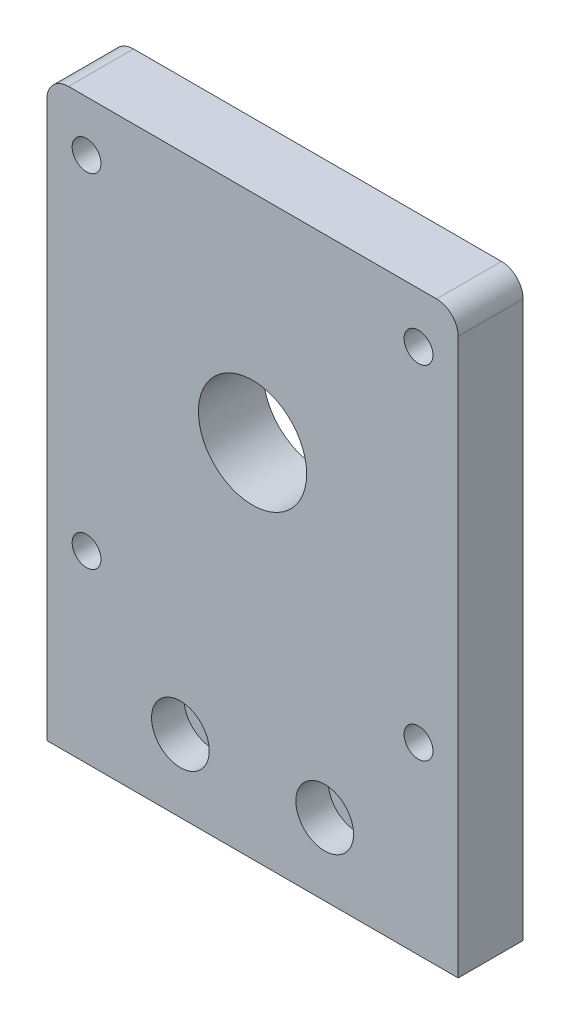
ISO-10303-21;
HEADER;
FILE_DESCRIPTION(('STEP AP214'),'2;1');
FILE_NAME('part.step','',(''),(''),'','','');
FILE_SCHEMA(('AUTOMOTIVE_DESIGN { 1 0 10303 214 1 1 1 1 }'));
ENDSEC;
DATA;
#1=APPLICATION_CONTEXT('core data for automotive mechanical design processes');
#2=APPLICATION_PROTOCOL_DEFINITION('international standard','automotive_design',2000,#1);
#3=PRODUCT_CONTEXT('',#1,'mechanical');
#4=PRODUCT('Part','Part','',(#3));
#5=PRODUCT_RELATED_PRODUCT_CATEGORY('part','',(#4));
#6=PRODUCT_DEFINITION_FORMATION('','',#4);
#7=PRODUCT_DEFINITION_CONTEXT('part definition',#1,'design');
#8=PRODUCT_DEFINITION('design','',#6,#7);
#9=PRODUCT_DEFINITION_SHAPE('','',#8);
#10=(LENGTH_UNIT() NAMED_UNIT(*) SI_UNIT(.MILLI.,.METRE.));
#11=(NAMED_UNIT(*) PLANE_ANGLE_UNIT() SI_UNIT($,.RADIAN.));
#12=(NAMED_UNIT(*) SI_UNIT($,.STERADIAN.) SOLID_ANGLE_UNIT());
#13=UNCERTAINTY_MEASURE_WITH_UNIT(LENGTH_MEASURE(1.E-05),#10,'distance_accuracy_value','');
#14=(GEOMETRIC_REPRESENTATION_CONTEXT(3) GLOBAL_UNCERTAINTY_ASSIGNED_CONTEXT((#13)) GLOBAL_UNIT_ASSIGNED_CONTEXT((#10,
#11,#12)) REPRESENTATION_CONTEXT('',''));
#15=CARTESIAN_POINT('',(0.,0.,0.));
#16=DIRECTION('',(0.,0.,1.));
#17=DIRECTION('',(1.,0.,0.));
#18=AXIS2_PLACEMENT_3D('',#15,#16,#17);
#19=CARTESIAN_POINT('',(10.,-30.,9.));
#20=DIRECTION('',(0.,0.,-1.));
#21=DIRECTION('',(-1.,0.,0.));
#22=AXIS2_PLACEMENT_3D('',#19,#20,#21);
#23=CYLINDRICAL_SURFACE('',#22,2.);
#24=CARTESIAN_POINT('',(10.,-30.,0.));
#25=DIRECTION('',(0.,0.,1.));
#26=DIRECTION('',(1.,0.,0.));
#27=AXIS2_PLACEMENT_3D('',#24,#25,#26);
#28=CIRCLE('',#27,2.);
#29=CARTESIAN_POINT('',(12.,-30.,0.));
#30=VERTEX_POINT('',#29);
#31=EDGE_CURVE('E182',#30,#30,#28,.T.);
#32=ORIENTED_EDGE('',*,*,#31,.F.);
#33=EDGE_LOOP('',(#32));
#34=FACE_BOUND('',#33,.T.);
#35=CARTESIAN_POINT('',(10.,-30.,4.5));
#36=DIRECTION('',(0.,0.,1.));
#37=DIRECTION('',(1.,0.,0.));
#38=AXIS2_PLACEMENT_3D('',#35,#36,#37);
#39=CIRCLE('',#38,2.);
#40=CARTESIAN_POINT('',(12.,-30.,4.5));
#41=VERTEX_POINT('',#40);
#42=EDGE_CURVE('E39',#41,#41,#39,.T.);
#43=ORIENTED_EDGE('',*,*,#42,.T.);
#44=EDGE_LOOP('',(#43));
#45=FACE_BOUND('',#44,.T.);
#46=ADVANCED_FACE('F35',(#34,#45),#23,.F.);
#47=CARTESIAN_POINT('',(-9.99999999999999,-30.,9.));
#48=DIRECTION('',(0.,0.,-1.));
#49=DIRECTION('',(-1.,0.,0.));
#50=AXIS2_PLACEMENT_3D('',#47,#48,#49);
#51=CYLINDRICAL_SURFACE('',#50,2.);
#52=CARTESIAN_POINT('',(-9.99999999999999,-30.,0.));
#53=DIRECTION('',(0.,0.,1.));
#54=DIRECTION('',(1.,0.,0.));
#55=AXIS2_PLACEMENT_3D('',#52,#53,#54);
#56=CIRCLE('',#55,2.);
#57=CARTESIAN_POINT('',(-7.99999999999999,-30.,0.));
#58=VERTEX_POINT('',#57);
#59=EDGE_CURVE('E177',#58,#58,#56,.T.);
#60=ORIENTED_EDGE('',*,*,#59,.F.);
#61=EDGE_LOOP('',(#60));
#62=FACE_BOUND('',#61,.T.);
#63=CARTESIAN_POINT('',(-9.99999999999999,-30.,4.5));
#64=DIRECTION('',(0.,0.,1.));
#65=DIRECTION('',(1.,0.,0.));
#66=AXIS2_PLACEMENT_3D('',#63,#64,#65);
#67=CIRCLE('',#66,2.);
#68=CARTESIAN_POINT('',(-7.99999999999999,-30.,4.5));
#69=VERTEX_POINT('',#68);
#70=EDGE_CURVE('E139',#69,#69,#67,.T.);
#71=ORIENTED_EDGE('',*,*,#70,.T.);
#72=EDGE_LOOP('',(#71));
#73=FACE_BOUND('',#72,.T.);
#74=ADVANCED_FACE('F216',(#62,#73),#51,.F.);
#75=CARTESIAN_POINT('',(-25.5,37.,9.));
#76=DIRECTION('',(0.,0.,1.));
#77=DIRECTION('',(1.,0.,0.));
#78=AXIS2_PLACEMENT_3D('',#75,#76,#77);
#79=PLANE('',#78);
#80=CARTESIAN_POINT('',(10.,-30.,9.));
#81=DIRECTION('',(0.,0.,1.));
#82=DIRECTION('',(1.,0.,0.));
#83=AXIS2_PLACEMENT_3D('',#80,#81,#82);
#84=CIRCLE('',#83,4.);
#85=CARTESIAN_POINT('',(14.,-30.,9.));
#86=VERTEX_POINT('',#85);
#87=EDGE_CURVE('E156',#86,#86,#84,.T.);
#88=ORIENTED_EDGE('',*,*,#87,.F.);
#89=EDGE_LOOP('',(#88));
#90=FACE_BOUND('',#89,.T.);
#91=CARTESIAN_POINT('',(-9.99999999999999,-30.,9.));
#92=DIRECTION('',(0.,0.,1.));
#93=DIRECTION('',(1.,0.,0.));
#94=AXIS2_PLACEMENT_3D('',#91,#92,#93);
#95=CIRCLE('',#94,4.);
#96=CARTESIAN_POINT('',(-5.99999999999999,-30.,9.));
#97=VERTEX_POINT('',#96);
#98=EDGE_CURVE('E149',#97,#97,#95,.T.);
#99=ORIENTED_EDGE('',*,*,#98,.F.);
#100=EDGE_LOOP('',(#99));
#101=FACE_BOUND('',#100,.T.);
#102=CARTESIAN_POINT('',(23.,-14.5,9.));
#103=DIRECTION('',(0.,0.,1.));
#104=DIRECTION('',(-1.,0.,0.));
#105=AXIS2_PLACEMENT_3D('',#102,#103,#104);
#106=CIRCLE('',#105,2.);
#107=CARTESIAN_POINT('',(21.,-14.5,9.));
#108=VERTEX_POINT('',#107);
#109=EDGE_CURVE('E162',#108,#108,#106,.T.);
#110=ORIENTED_EDGE('',*,*,#109,.F.);
#111=EDGE_LOOP('',(#110));
#112=FACE_BOUND('',#111,.T.);
#113=CARTESIAN_POINT('',(-23.,33.,9.));
#114=DIRECTION('',(0.,0.,1.));
#115=DIRECTION('',(1.,0.,0.));
#116=AXIS2_PLACEMENT_3D('',#113,#114,#115);
#117=CIRCLE('',#116,2.);
#118=CARTESIAN_POINT('',(-21.,33.,9.));
#119=VERTEX_POINT('',#118);
#120=EDGE_CURVE('E174',#119,#119,#117,.T.);
#121=ORIENTED_EDGE('',*,*,#120,.F.);
#122=EDGE_LOOP('',(#121));
#123=FACE_BOUND('',#122,.T.);
#124=DIRECTION('',(0.,1.,0.));
#125=VECTOR('',#124,1.);
#126=CARTESIAN_POINT('',(28.5,37.,9.));
#127=LINE('',#126,#125);
#128=CARTESIAN_POINT('',(28.5,-40.,9.));
#129=VERTEX_POINT('',#128);
#130=CARTESIAN_POINT('',(28.5,37.,9.));
#131=VERTEX_POINT('',#130);
#132=EDGE_CURVE('E134',#129,#131,#127,.T.);
#133=ORIENTED_EDGE('',*,*,#132,.T.);
#134=CARTESIAN_POINT('',(25.5,37.,9.));
#135=DIRECTION('',(0.,0.,1.));
#136=DIRECTION('',(-1.,0.,0.));
#137=AXIS2_PLACEMENT_3D('',#134,#135,#136);
#138=CIRCLE('',#137,3.);
#139=CARTESIAN_POINT('',(25.5,40.,9.));
#140=VERTEX_POINT('',#139);
#141=EDGE_CURVE('E91',#131,#140,#138,.T.);
#142=ORIENTED_EDGE('',*,*,#141,.T.);
#143=DIRECTION('',(-1.,0.,0.));
#144=VECTOR('',#143,1.);
#145=CARTESIAN_POINT('',(-25.5,40.,9.));
#146=LINE('',#145,#144);
#147=CARTESIAN_POINT('',(-25.5,40.,9.));
#148=VERTEX_POINT('',#147);
#149=EDGE_CURVE('E105',#140,#148,#146,.T.);
#150=ORIENTED_EDGE('',*,*,#149,.T.);
#151=CARTESIAN_POINT('',(-25.5,37.,9.));
#152=DIRECTION('',(0.,0.,1.));
#153=DIRECTION('',(1.,0.,0.));
#154=AXIS2_PLACEMENT_3D('',#151,#152,#153);
#155=CIRCLE('',#154,3.);
#156=CARTESIAN_POINT('',(-28.5,37.,9.));
#157=VERTEX_POINT('',#156);
#158=EDGE_CURVE('E98',#148,#157,#155,.T.);
#159=ORIENTED_EDGE('',*,*,#158,.T.);
#160=DIRECTION('',(0.,-1.,0.));
#161=VECTOR('',#160,1.);
#162=CARTESIAN_POINT('',(-28.5,37.,9.));
#163=LINE('',#162,#161);
#164=CARTESIAN_POINT('',(-28.5,-40.,9.));
#165=VERTEX_POINT('',#164);
#166=EDGE_CURVE('E103',#157,#165,#163,.T.);
#167=ORIENTED_EDGE('',*,*,#166,.T.);
#168=DIRECTION('',(1.,0.,0.));
#169=VECTOR('',#168,1.);
#170=CARTESIAN_POINT('',(-28.5,-40.,9.));
#171=LINE('',#170,#169);
#172=EDGE_CURVE('E54',#165,#129,#171,.T.);
#173=ORIENTED_EDGE('',*,*,#172,.T.);
#174=EDGE_LOOP('',(#133,#142,#150,#159,#167,#173));
#175=FACE_BOUND('',#174,.T.);
#176=CARTESIAN_POINT('',(0.,10.,9.));
#177=DIRECTION('',(0.,0.,1.));
#178=DIRECTION('',(1.,0.,0.));
#179=AXIS2_PLACEMENT_3D('',#176,#177,#178);
#180=CIRCLE('',#179,7.5);
#181=CARTESIAN_POINT('',(7.5,10.,9.));
#182=VERTEX_POINT('',#181);
#183=EDGE_CURVE('E127',#182,#182,#180,.T.);
#184=ORIENTED_EDGE('',*,*,#183,.F.);
#185=EDGE_LOOP('',(#184));
#186=FACE_BOUND('',#185,.T.);
#187=CARTESIAN_POINT('',(-23.,-14.5,9.));
#188=DIRECTION('',(0.,0.,1.));
#189=DIRECTION('',(1.,0.,0.));
#190=AXIS2_PLACEMENT_3D('',#187,#188,#189);
#191=CIRCLE('',#190,2.);
#192=CARTESIAN_POINT('',(-21.,-14.5,9.));
#193=VERTEX_POINT('',#192);
#194=EDGE_CURVE('E168',#193,#193,#191,.T.);
#195=ORIENTED_EDGE('',*,*,#194,.F.);
#196=EDGE_LOOP('',(#195));
#197=FACE_BOUND('',#196,.T.);
#198=CARTESIAN_POINT('',(23.,33.,9.));
#199=DIRECTION('',(0.,0.,1.));
#200=DIRECTION('',(-1.,0.,0.));
#201=AXIS2_PLACEMENT_3D('',#198,#199,#200);
#202=CIRCLE('',#201,2.);
#203=CARTESIAN_POINT('',(21.,33.,9.));
#204=VERTEX_POINT('',#203);
#205=EDGE_CURVE('E146',#204,#204,#202,.T.);
#206=ORIENTED_EDGE('',*,*,#205,.F.);
#207=EDGE_LOOP('',(#206));
#208=FACE_BOUND('',#207,.T.);
#209=ADVANCED_FACE('F100',(#90,#101,#112,#123,#175,#186,#197,#208),#79,.T.);
#210=CARTESIAN_POINT('',(-25.5,37.,0.));
#211=DIRECTION('',(0.,0.,1.));
#212=DIRECTION('',(1.,0.,0.));
#213=AXIS2_PLACEMENT_3D('',#210,#211,#212);
#214=PLANE('',#213);
#215=DIRECTION('',(0.,1.,0.));
#216=VECTOR('',#215,1.);
#217=CARTESIAN_POINT('',(28.5,37.,0.));
#218=LINE('',#217,#216);
#219=CARTESIAN_POINT('',(28.5,-40.,0.));
#220=VERTEX_POINT('',#219);
#221=CARTESIAN_POINT('',(28.5,37.,0.));
#222=VERTEX_POINT('',#221);
#223=EDGE_CURVE('E123',#220,#222,#218,.T.);
#224=ORIENTED_EDGE('',*,*,#223,.F.);
#225=DIRECTION('',(1.,0.,0.));
#226=VECTOR('',#225,1.);
#227=CARTESIAN_POINT('',(-28.5,-40.,0.));
#228=LINE('',#227,#226);
#229=CARTESIAN_POINT('',(-28.5,-40.,0.));
#230=VERTEX_POINT('',#229);
#231=EDGE_CURVE('E83',#230,#220,#228,.T.);
#232=ORIENTED_EDGE('',*,*,#231,.F.);
#233=DIRECTION('',(0.,-1.,0.));
#234=VECTOR('',#233,1.);
#235=CARTESIAN_POINT('',(-28.5,37.,0.));
#236=LINE('',#235,#234);
#237=CARTESIAN_POINT('',(-28.5,37.,0.));
#238=VERTEX_POINT('',#237);
#239=EDGE_CURVE('E77',#238,#230,#236,.T.);
#240=ORIENTED_EDGE('',*,*,#239,.F.);
#241=CARTESIAN_POINT('',(-25.5,37.,0.));
#242=DIRECTION('',(0.,0.,1.));
#243=DIRECTION('',(1.,0.,0.));
#244=AXIS2_PLACEMENT_3D('',#241,#242,#243);
#245=CIRCLE('',#244,3.);
#246=CARTESIAN_POINT('',(-25.5,40.,0.));
#247=VERTEX_POINT('',#246);
#248=EDGE_CURVE('E113',#247,#238,#245,.T.);
#249=ORIENTED_EDGE('',*,*,#248,.F.);
#250=DIRECTION('',(-1.,0.,0.));
#251=VECTOR('',#250,1.);
#252=CARTESIAN_POINT('',(-25.5,40.,0.));
#253=LINE('',#252,#251);
#254=CARTESIAN_POINT('',(25.5,40.,0.));
#255=VERTEX_POINT('',#254);
#256=EDGE_CURVE('E129',#255,#247,#253,.T.);
#257=ORIENTED_EDGE('',*,*,#256,.F.);
#258=CARTESIAN_POINT('',(25.5,37.,0.));
#259=DIRECTION('',(0.,0.,1.));
#260=DIRECTION('',(-1.,0.,0.));
#261=AXIS2_PLACEMENT_3D('',#258,#259,#260);
#262=CIRCLE('',#261,3.);
#263=EDGE_CURVE('E126',#222,#255,#262,.T.);
#264=ORIENTED_EDGE('',*,*,#263,.F.);
#265=EDGE_LOOP('',(#224,#232,#240,#249,#257,#264));
#266=FACE_BOUND('',#265,.T.);
#267=CARTESIAN_POINT('',(0.,10.,0.));
#268=DIRECTION('',(0.,0.,1.));
#269=DIRECTION('',(1.,0.,0.));
#270=AXIS2_PLACEMENT_3D('',#267,#268,#269);
#271=CIRCLE('',#270,7.5);
#272=CARTESIAN_POINT('',(7.5,10.,0.));
#273=VERTEX_POINT('',#272);
#274=EDGE_CURVE('E185',#273,#273,#271,.T.);
#275=ORIENTED_EDGE('',*,*,#274,.T.);
#276=EDGE_LOOP('',(#275));
#277=FACE_BOUND('',#276,.T.);
#278=ORIENTED_EDGE('',*,*,#31,.T.);
#279=EDGE_LOOP('',(#278));
#280=FACE_BOUND('',#279,.T.);
#281=ORIENTED_EDGE('',*,*,#59,.T.);
#282=EDGE_LOOP('',(#281));
#283=FACE_BOUND('',#282,.T.);
#284=CARTESIAN_POINT('',(-23.,33.,0.));
#285=DIRECTION('',(0.,0.,1.));
#286=DIRECTION('',(1.,0.,0.));
#287=AXIS2_PLACEMENT_3D('',#284,#285,#286);
#288=CIRCLE('',#287,2.);
#289=CARTESIAN_POINT('',(-21.,33.,0.));
#290=VERTEX_POINT('',#289);
#291=EDGE_CURVE('E171',#290,#290,#288,.T.);
#292=ORIENTED_EDGE('',*,*,#291,.T.);
#293=EDGE_LOOP('',(#292));
#294=FACE_BOUND('',#293,.T.);
#295=CARTESIAN_POINT('',(-23.,-14.5,0.));
#296=DIRECTION('',(0.,0.,1.));
#297=DIRECTION('',(1.,0.,0.));
#298=AXIS2_PLACEMENT_3D('',#295,#296,#297);
#299=CIRCLE('',#298,2.);
#300=CARTESIAN_POINT('',(-21.,-14.5,0.));
#301=VERTEX_POINT('',#300);
#302=EDGE_CURVE('E165',#301,#301,#299,.T.);
#303=ORIENTED_EDGE('',*,*,#302,.T.);
#304=EDGE_LOOP('',(#303));
#305=FACE_BOUND('',#304,.T.);
#306=CARTESIAN_POINT('',(23.,-14.5,0.));
#307=DIRECTION('',(0.,0.,1.));
#308=DIRECTION('',(-1.,0.,0.));
#309=AXIS2_PLACEMENT_3D('',#306,#307,#308);
#310=CIRCLE('',#309,2.);
#311=CARTESIAN_POINT('',(21.,-14.5,0.));
#312=VERTEX_POINT('',#311);
#313=EDGE_CURVE('E160',#312,#312,#310,.T.);
#314=ORIENTED_EDGE('',*,*,#313,.T.);
#315=EDGE_LOOP('',(#314));
#316=FACE_BOUND('',#315,.T.);
#317=CARTESIAN_POINT('',(23.,33.,0.));
#318=DIRECTION('',(0.,0.,1.));
#319=DIRECTION('',(-1.,0.,0.));
#320=AXIS2_PLACEMENT_3D('',#317,#318,#319);
#321=CIRCLE('',#320,2.);
#322=CARTESIAN_POINT('',(21.,33.,0.));
#323=VERTEX_POINT('',#322);
#324=EDGE_CURVE('E141',#323,#323,#321,.T.);
#325=ORIENTED_EDGE('',*,*,#324,.T.);
#326=EDGE_LOOP('',(#325));
#327=FACE_BOUND('',#326,.T.);
#328=ADVANCED_FACE('F199',(#266,#277,#280,#283,#294,#305,#316,#327),#214,.F.);
#329=CARTESIAN_POINT('',(28.5,37.,9.));
#330=DIRECTION('',(-1.,0.,0.));
#331=DIRECTION('',(0.,-1.,0.));
#332=AXIS2_PLACEMENT_3D('',#329,#330,#331);
#333=PLANE('',#332);
#334=ORIENTED_EDGE('',*,*,#223,.T.);
#335=DIRECTION('',(0.,0.,-1.));
#336=VECTOR('',#335,1.);
#337=CARTESIAN_POINT('',(28.5,37.,9.));
#338=LINE('',#337,#336);
#339=EDGE_CURVE('E11',#131,#222,#338,.T.);
#340=ORIENTED_EDGE('',*,*,#339,.F.);
#341=ORIENTED_EDGE('',*,*,#132,.F.);
#342=DIRECTION('',(0.,0.,-1.));
#343=VECTOR('',#342,1.);
#344=CARTESIAN_POINT('',(28.5,-40.,9.));
#345=LINE('',#344,#343);
#346=EDGE_CURVE('E119',#129,#220,#345,.T.);
#347=ORIENTED_EDGE('',*,*,#346,.T.);
#348=EDGE_LOOP('',(#334,#340,#341,#347));
#349=FACE_BOUND('',#348,.T.);
#350=ADVANCED_FACE('F37',(#349),#333,.F.);
#351=CARTESIAN_POINT('',(25.5,37.,9.));
#352=DIRECTION('',(0.,0.,-1.));
#353=DIRECTION('',(-1.,0.,0.));
#354=AXIS2_PLACEMENT_3D('',#351,#352,#353);
#355=CYLINDRICAL_SURFACE('',#354,3.);
#356=ORIENTED_EDGE('',*,*,#263,.T.);
#357=DIRECTION('',(0.,0.,-1.));
#358=VECTOR('',#357,1.);
#359=CARTESIAN_POINT('',(25.5,40.,9.));
#360=LINE('',#359,#358);
#361=EDGE_CURVE('E45',#140,#255,#360,.T.);
#362=ORIENTED_EDGE('',*,*,#361,.F.);
#363=ORIENTED_EDGE('',*,*,#141,.F.);
#364=ORIENTED_EDGE('',*,*,#339,.T.);
#365=EDGE_LOOP('',(#356,#362,#363,#364));
#366=FACE_BOUND('',#365,.T.);
#367=ADVANCED_FACE('F193',(#366),#355,.T.);
#368=CARTESIAN_POINT('',(-25.5,40.,9.));
#369=DIRECTION('',(0.,-1.,0.));
#370=DIRECTION('',(1.,0.,0.));
#371=AXIS2_PLACEMENT_3D('',#368,#369,#370);
#372=PLANE('',#371);
#373=ORIENTED_EDGE('',*,*,#256,.T.);
#374=DIRECTION('',(0.,0.,-1.));
#375=VECTOR('',#374,1.);
#376=CARTESIAN_POINT('',(-25.5,40.,9.));
#377=LINE('',#376,#375);
#378=EDGE_CURVE('E114',#148,#247,#377,.T.);
#379=ORIENTED_EDGE('',*,*,#378,.F.);
#380=ORIENTED_EDGE('',*,*,#149,.F.);
#381=ORIENTED_EDGE('',*,*,#361,.T.);
#382=EDGE_LOOP('',(#373,#379,#380,#381));
#383=FACE_BOUND('',#382,.T.);
#384=ADVANCED_FACE('F196',(#383),#372,.F.);
#385=CARTESIAN_POINT('',(-25.5,37.,9.));
#386=DIRECTION('',(0.,0.,-1.));
#387=DIRECTION('',(-1.,0.,0.));
#388=AXIS2_PLACEMENT_3D('',#385,#386,#387);
#389=CYLINDRICAL_SURFACE('',#388,3.);
#390=ORIENTED_EDGE('',*,*,#248,.T.);
#391=DIRECTION('',(0.,0.,-1.));
#392=VECTOR('',#391,1.);
#393=CARTESIAN_POINT('',(-28.5,37.,9.));
#394=LINE('',#393,#392);
#395=EDGE_CURVE('E110',#157,#238,#394,.T.);
#396=ORIENTED_EDGE('',*,*,#395,.F.);
#397=ORIENTED_EDGE('',*,*,#158,.F.);
#398=ORIENTED_EDGE('',*,*,#378,.T.);
#399=EDGE_LOOP('',(#390,#396,#397,#398));
#400=FACE_BOUND('',#399,.T.);
#401=ADVANCED_FACE('F111',(#400),#389,.T.);
#402=CARTESIAN_POINT('',(-28.5,37.,9.));
#403=DIRECTION('',(1.,0.,0.));
#404=DIRECTION('',(0.,1.,0.));
#405=AXIS2_PLACEMENT_3D('',#402,#403,#404);
#406=PLANE('',#405);
#407=ORIENTED_EDGE('',*,*,#239,.T.);
#408=DIRECTION('',(0.,0.,-1.));
#409=VECTOR('',#408,1.);
#410=CARTESIAN_POINT('',(-28.5,-40.,9.));
#411=LINE('',#410,#409);
#412=EDGE_CURVE('E115',#165,#230,#411,.T.);
#413=ORIENTED_EDGE('',*,*,#412,.F.);
#414=ORIENTED_EDGE('',*,*,#166,.F.);
#415=ORIENTED_EDGE('',*,*,#395,.T.);
#416=EDGE_LOOP('',(#407,#413,#414,#415));
#417=FACE_BOUND('',#416,.T.);
#418=ADVANCED_FACE('F117',(#417),#406,.F.);
#419=CARTESIAN_POINT('',(-28.5,-40.,9.));
#420=DIRECTION('',(0.,1.,0.));
#421=DIRECTION('',(0.,0.,1.));
#422=AXIS2_PLACEMENT_3D('',#419,#420,#421);
#423=PLANE('',#422);
#424=ORIENTED_EDGE('',*,*,#231,.T.);
#425=ORIENTED_EDGE('',*,*,#346,.F.);
#426=ORIENTED_EDGE('',*,*,#172,.F.);
#427=ORIENTED_EDGE('',*,*,#412,.T.);
#428=EDGE_LOOP('',(#424,#425,#426,#427));
#429=FACE_BOUND('',#428,.T.);
#430=ADVANCED_FACE('F202',(#429),#423,.F.);
#431=CARTESIAN_POINT('',(0.,10.,9.));
#432=DIRECTION('',(0.,0.,-1.));
#433=DIRECTION('',(-1.,0.,0.));
#434=AXIS2_PLACEMENT_3D('',#431,#432,#433);
#435=CYLINDRICAL_SURFACE('',#434,7.5);
#436=ORIENTED_EDGE('',*,*,#183,.T.);
#437=EDGE_LOOP('',(#436));
#438=FACE_BOUND('',#437,.T.);
#439=ORIENTED_EDGE('',*,*,#274,.F.);
#440=EDGE_LOOP('',(#439));
#441=FACE_BOUND('',#440,.T.);
#442=ADVANCED_FACE('F204',(#438,#441),#435,.F.);
#443=CARTESIAN_POINT('',(-23.,33.,9.));
#444=DIRECTION('',(0.,0.,-1.));
#445=DIRECTION('',(-1.,0.,0.));
#446=AXIS2_PLACEMENT_3D('',#443,#444,#445);
#447=CYLINDRICAL_SURFACE('',#446,2.);
#448=ORIENTED_EDGE('',*,*,#120,.T.);
#449=EDGE_LOOP('',(#448));
#450=FACE_BOUND('',#449,.T.);
#451=ORIENTED_EDGE('',*,*,#291,.F.);
#452=EDGE_LOOP('',(#451));
#453=FACE_BOUND('',#452,.T.);
#454=ADVANCED_FACE('F210',(#450,#453),#447,.F.);
#455=CARTESIAN_POINT('',(-23.,-14.5,9.));
#456=DIRECTION('',(0.,0.,-1.));
#457=DIRECTION('',(-1.,0.,0.));
#458=AXIS2_PLACEMENT_3D('',#455,#456,#457);
#459=CYLINDRICAL_SURFACE('',#458,2.);
#460=ORIENTED_EDGE('',*,*,#194,.T.);
#461=EDGE_LOOP('',(#460));
#462=FACE_BOUND('',#461,.T.);
#463=ORIENTED_EDGE('',*,*,#302,.F.);
#464=EDGE_LOOP('',(#463));
#465=FACE_BOUND('',#464,.T.);
#466=ADVANCED_FACE('F270',(#462,#465),#459,.F.);
#467=CARTESIAN_POINT('',(23.,-14.5,9.));
#468=DIRECTION('',(0.,0.,-1.));
#469=DIRECTION('',(-1.,0.,0.));
#470=AXIS2_PLACEMENT_3D('',#467,#468,#469);
#471=CYLINDRICAL_SURFACE('',#470,2.);
#472=ORIENTED_EDGE('',*,*,#109,.T.);
#473=EDGE_LOOP('',(#472));
#474=FACE_BOUND('',#473,.T.);
#475=ORIENTED_EDGE('',*,*,#313,.F.);
#476=EDGE_LOOP('',(#475));
#477=FACE_BOUND('',#476,.T.);
#478=ADVANCED_FACE('F279',(#474,#477),#471,.F.);
#479=CARTESIAN_POINT('',(23.,33.,9.));
#480=DIRECTION('',(0.,0.,-1.));
#481=DIRECTION('',(-1.,0.,0.));
#482=AXIS2_PLACEMENT_3D('',#479,#480,#481);
#483=CYLINDRICAL_SURFACE('',#482,2.);
#484=ORIENTED_EDGE('',*,*,#205,.T.);
#485=EDGE_LOOP('',(#484));
#486=FACE_BOUND('',#485,.T.);
#487=ORIENTED_EDGE('',*,*,#324,.F.);
#488=EDGE_LOOP('',(#487));
#489=FACE_BOUND('',#488,.T.);
#490=ADVANCED_FACE('F289',(#486,#489),#483,.F.);
#491=CARTESIAN_POINT('',(-9.99999999999999,-30.,4.5));
#492=DIRECTION('',(0.,0.,1.));
#493=DIRECTION('',(1.,0.,0.));
#494=AXIS2_PLACEMENT_3D('',#491,#492,#493);
#495=CYLINDRICAL_SURFACE('',#494,4.);
#496=CARTESIAN_POINT('',(-9.99999999999999,-30.,4.5));
#497=DIRECTION('',(0.,0.,1.));
#498=DIRECTION('',(1.,0.,0.));
#499=AXIS2_PLACEMENT_3D('',#496,#497,#498);
#500=CIRCLE('',#499,4.);
#501=CARTESIAN_POINT('',(-5.99999999999999,-30.,4.5));
#502=VERTEX_POINT('',#501);
#503=EDGE_CURVE('E142',#502,#502,#500,.T.);
#504=ORIENTED_EDGE('',*,*,#503,.F.);
#505=EDGE_LOOP('',(#504));
#506=FACE_BOUND('',#505,.T.);
#507=ORIENTED_EDGE('',*,*,#98,.T.);
#508=EDGE_LOOP('',(#507));
#509=FACE_BOUND('',#508,.T.);
#510=ADVANCED_FACE('F298',(#506,#509),#495,.F.);
#511=CARTESIAN_POINT('',(-9.99999999999999,-30.,4.5));
#512=DIRECTION('',(0.,0.,1.));
#513=DIRECTION('',(1.,0.,0.));
#514=AXIS2_PLACEMENT_3D('',#511,#512,#513);
#515=PLANE('',#514);
#516=ORIENTED_EDGE('',*,*,#70,.F.);
#517=EDGE_LOOP('',(#516));
#518=FACE_BOUND('',#517,.T.);
#519=ORIENTED_EDGE('',*,*,#503,.T.);
#520=EDGE_LOOP('',(#519));
#521=FACE_BOUND('',#520,.T.);
#522=ADVANCED_FACE('F326',(#518,#521),#515,.T.);
#523=CARTESIAN_POINT('',(10.,-30.,4.5));
#524=DIRECTION('',(0.,0.,1.));
#525=DIRECTION('',(1.,0.,0.));
#526=AXIS2_PLACEMENT_3D('',#523,#524,#525);
#527=CYLINDRICAL_SURFACE('',#526,4.);
#528=CARTESIAN_POINT('',(10.,-30.,4.5));
#529=DIRECTION('',(0.,0.,1.));
#530=DIRECTION('',(1.,0.,0.));
#531=AXIS2_PLACEMENT_3D('',#528,#529,#530);
#532=CIRCLE('',#531,4.);
#533=CARTESIAN_POINT('',(14.,-30.,4.5));
#534=VERTEX_POINT('',#533);
#535=EDGE_CURVE('E365',#534,#534,#532,.T.);
#536=ORIENTED_EDGE('',*,*,#535,.F.);
#537=EDGE_LOOP('',(#536));
#538=FACE_BOUND('',#537,.T.);
#539=ORIENTED_EDGE('',*,*,#87,.T.);
#540=EDGE_LOOP('',(#539));
#541=FACE_BOUND('',#540,.T.);
#542=ADVANCED_FACE('F336',(#538,#541),#527,.F.);
#543=CARTESIAN_POINT('',(10.,-30.,4.5));
#544=DIRECTION('',(0.,0.,1.));
#545=DIRECTION('',(1.,0.,0.));
#546=AXIS2_PLACEMENT_3D('',#543,#544,#545);
#547=PLANE('',#546);
#548=ORIENTED_EDGE('',*,*,#42,.F.);
#549=EDGE_LOOP('',(#548));
#550=FACE_BOUND('',#549,.T.);
#551=ORIENTED_EDGE('',*,*,#535,.T.);
#552=EDGE_LOOP('',(#551));
#553=FACE_BOUND('',#552,.T.);
#554=ADVANCED_FACE('F346',(#550,#553),#547,.T.);
#555=CLOSED_SHELL('',(#46,#74,#209,#328,#350,#367,#384,#401,#418,#430,#442,#454,#466,#478,#490,
#510,#522,#542,#554));
#556=MANIFOLD_SOLID_BREP('B2',#555);
#557=ADVANCED_BREP_SHAPE_REPRESENTATION('',(#18,#556),#14);
#558=SHAPE_DEFINITION_REPRESENTATION(#9,#557);
ENDSEC;
END-ISO-10303-21;
